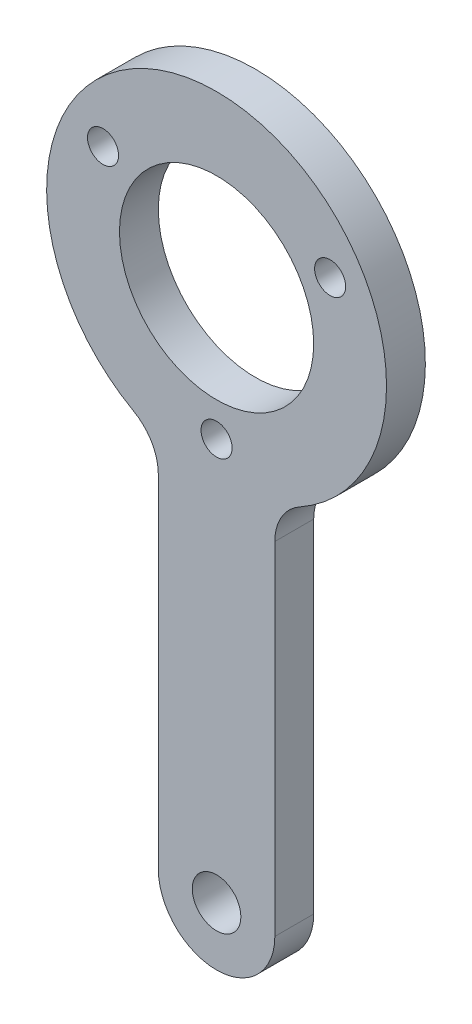
ISO-10303-21;
HEADER;
FILE_DESCRIPTION(('STEP AP214'),'2;1');
FILE_NAME('part.step','',(''),(''),'','','');
FILE_SCHEMA(('AUTOMOTIVE_DESIGN { 1 0 10303 214 1 1 1 1 }'));
ENDSEC;
DATA;
#1=APPLICATION_CONTEXT('core data for automotive mechanical design processes');
#2=APPLICATION_PROTOCOL_DEFINITION('international standard','automotive_design',2000,#1);
#3=PRODUCT_CONTEXT('',#1,'mechanical');
#4=PRODUCT('Part','Part','',(#3));
#5=PRODUCT_RELATED_PRODUCT_CATEGORY('part','',(#4));
#6=PRODUCT_DEFINITION_FORMATION('','',#4);
#7=PRODUCT_DEFINITION_CONTEXT('part definition',#1,'design');
#8=PRODUCT_DEFINITION('design','',#6,#7);
#9=PRODUCT_DEFINITION_SHAPE('','',#8);
#10=(LENGTH_UNIT() NAMED_UNIT(*) SI_UNIT(.MILLI.,.METRE.));
#11=(NAMED_UNIT(*) PLANE_ANGLE_UNIT() SI_UNIT($,.RADIAN.));
#12=(NAMED_UNIT(*) SI_UNIT($,.STERADIAN.) SOLID_ANGLE_UNIT());
#13=UNCERTAINTY_MEASURE_WITH_UNIT(LENGTH_MEASURE(1.E-05),#10,'distance_accuracy_value','');
#14=(GEOMETRIC_REPRESENTATION_CONTEXT(3) GLOBAL_UNCERTAINTY_ASSIGNED_CONTEXT((#13)) GLOBAL_UNIT_ASSIGNED_CONTEXT((#10,
#11,#12)) REPRESENTATION_CONTEXT('',''));
#15=CARTESIAN_POINT('',(0.,0.,0.));
#16=DIRECTION('',(0.,0.,1.));
#17=DIRECTION('',(1.,0.,0.));
#18=AXIS2_PLACEMENT_3D('',#15,#16,#17);
#19=CARTESIAN_POINT('',(6.,-7.36545993132812,4.));
#20=DIRECTION('',(-1.,0.,0.));
#21=DIRECTION('',(0.,-1.,0.));
#22=AXIS2_PLACEMENT_3D('',#19,#20,#21);
#23=PLANE('',#22);
#24=DIRECTION('',(0.,1.,0.));
#25=VECTOR('',#24,1.);
#26=CARTESIAN_POINT('',(6.,-7.36545993132812,0.));
#27=LINE('',#26,#25);
#28=CARTESIAN_POINT('',(6.,-54.8489383568842,0.));
#29=VERTEX_POINT('',#28);
#30=CARTESIAN_POINT('',(6.,-19.6277864263905,0.));
#31=VERTEX_POINT('',#30);
#32=EDGE_CURVE('E65',#29,#31,#27,.T.);
#33=ORIENTED_EDGE('',*,*,#32,.T.);
#34=DIRECTION('',(0.,0.,1.));
#35=VECTOR('',#34,1.);
#36=CARTESIAN_POINT('',(6.,-19.6277864263905,4.));
#37=LINE('',#36,#35);
#38=CARTESIAN_POINT('',(6.,-19.6277864263905,4.));
#39=VERTEX_POINT('',#38);
#40=EDGE_CURVE('E163',#31,#39,#37,.T.);
#41=ORIENTED_EDGE('',*,*,#40,.T.);
#42=DIRECTION('',(0.,1.,0.));
#43=VECTOR('',#42,1.);
#44=CARTESIAN_POINT('',(6.,-7.36545993132812,4.));
#45=LINE('',#44,#43);
#46=CARTESIAN_POINT('',(6.,-54.8489383568842,4.));
#47=VERTEX_POINT('',#46);
#48=EDGE_CURVE('E57',#47,#39,#45,.T.);
#49=ORIENTED_EDGE('',*,*,#48,.F.);
#50=DIRECTION('',(0.,0.,1.));
#51=VECTOR('',#50,1.);
#52=CARTESIAN_POINT('',(6.,-54.8489383568842,0.));
#53=LINE('',#52,#51);
#54=EDGE_CURVE('E113',#29,#47,#53,.T.);
#55=ORIENTED_EDGE('',*,*,#54,.F.);
#56=EDGE_LOOP('',(#33,#41,#49,#55));
#57=FACE_BOUND('',#56,.T.);
#58=ADVANCED_FACE('F41',(#57),#23,.F.);
#59=CARTESIAN_POINT('',(-6.,-7.36545993132812,4.));
#60=DIRECTION('',(1.,0.,0.));
#61=DIRECTION('',(0.,1.,0.));
#62=AXIS2_PLACEMENT_3D('',#59,#60,#61);
#63=PLANE('',#62);
#64=DIRECTION('',(0.,0.,1.));
#65=VECTOR('',#64,1.);
#66=CARTESIAN_POINT('',(-6.,-54.8489383568842,0.));
#67=LINE('',#66,#65);
#68=CARTESIAN_POINT('',(-6.,-54.8489383568842,0.));
#69=VERTEX_POINT('',#68);
#70=CARTESIAN_POINT('',(-6.,-54.8489383568842,4.));
#71=VERTEX_POINT('',#70);
#72=EDGE_CURVE('E100',#69,#71,#67,.T.);
#73=ORIENTED_EDGE('',*,*,#72,.T.);
#74=DIRECTION('',(0.,-1.,0.));
#75=VECTOR('',#74,1.);
#76=CARTESIAN_POINT('',(-6.,-7.36545993132812,4.));
#77=LINE('',#76,#75);
#78=CARTESIAN_POINT('',(-6.,-19.6277864263905,4.));
#79=VERTEX_POINT('',#78);
#80=EDGE_CURVE('E155',#79,#71,#77,.T.);
#81=ORIENTED_EDGE('',*,*,#80,.F.);
#82=DIRECTION('',(0.,0.,1.));
#83=VECTOR('',#82,1.);
#84=CARTESIAN_POINT('',(-6.,-19.6277864263905,4.));
#85=LINE('',#84,#83);
#86=CARTESIAN_POINT('',(-6.,-19.6277864263905,0.));
#87=VERTEX_POINT('',#86);
#88=EDGE_CURVE('E103',#79,#87,#85,.F.);
#89=ORIENTED_EDGE('',*,*,#88,.T.);
#90=DIRECTION('',(0.,-1.,0.));
#91=VECTOR('',#90,1.);
#92=CARTESIAN_POINT('',(-6.,-7.36545993132812,0.));
#93=LINE('',#92,#91);
#94=EDGE_CURVE('E96',#87,#69,#93,.T.);
#95=ORIENTED_EDGE('',*,*,#94,.T.);
#96=EDGE_LOOP('',(#73,#81,#89,#95));
#97=FACE_BOUND('',#96,.T.);
#98=ADVANCED_FACE('F98',(#97),#63,.F.);
#99=CARTESIAN_POINT('',(0.,-45.,4.));
#100=DIRECTION('',(0.,0.,1.));
#101=DIRECTION('',(1.,0.,0.));
#102=AXIS2_PLACEMENT_3D('',#99,#100,#101);
#103=PLANE('',#102);
#104=CARTESIAN_POINT('',(0.,-54.8489383568842,4.));
#105=DIRECTION('',(0.,0.,1.));
#106=DIRECTION('',(1.,0.,0.));
#107=AXIS2_PLACEMENT_3D('',#104,#105,#106);
#108=CIRCLE('',#107,6.);
#109=EDGE_CURVE('E112',#71,#47,#108,.T.);
#110=ORIENTED_EDGE('',*,*,#109,.T.);
#111=ORIENTED_EDGE('',*,*,#48,.T.);
#112=CARTESIAN_POINT('',(11.,-19.6277864263905,4.));
#113=DIRECTION('',(0.,0.,1.));
#114=DIRECTION('',(1.,0.,0.));
#115=AXIS2_PLACEMENT_3D('',#112,#113,#114);
#116=CIRCLE('',#115,5.);
#117=CARTESIAN_POINT('',(8.55555555555556,-15.2660561094149,4.));
#118=VERTEX_POINT('',#117);
#119=EDGE_CURVE('E50',#39,#118,#116,.F.);
#120=ORIENTED_EDGE('',*,*,#119,.T.);
#121=CARTESIAN_POINT('',(0.,0.,4.));
#122=DIRECTION('',(0.,0.,1.));
#123=DIRECTION('',(1.,0.,0.));
#124=AXIS2_PLACEMENT_3D('',#121,#122,#123);
#125=CIRCLE('',#124,17.5);
#126=CARTESIAN_POINT('',(-8.55555555555556,-15.2660561094149,4.));
#127=VERTEX_POINT('',#126);
#128=EDGE_CURVE('E173',#118,#127,#125,.T.);
#129=ORIENTED_EDGE('',*,*,#128,.T.);
#130=CARTESIAN_POINT('',(-11.,-19.6277864263905,4.));
#131=DIRECTION('',(0.,0.,1.));
#132=DIRECTION('',(1.,0.,0.));
#133=AXIS2_PLACEMENT_3D('',#130,#131,#132);
#134=CIRCLE('',#133,5.);
#135=EDGE_CURVE('E169',#127,#79,#134,.F.);
#136=ORIENTED_EDGE('',*,*,#135,.T.);
#137=ORIENTED_EDGE('',*,*,#80,.T.);
#138=EDGE_LOOP('',(#110,#111,#120,#129,#136,#137));
#139=FACE_BOUND('',#138,.T.);
#140=CARTESIAN_POINT('',(-11.6913429510899,6.75,4.));
#141=DIRECTION('',(0.,0.,1.));
#142=DIRECTION('',(1.,0.,0.));
#143=AXIS2_PLACEMENT_3D('',#140,#141,#142);
#144=CIRCLE('',#143,1.6);
#145=CARTESIAN_POINT('',(-10.0913429510899,6.75,4.));
#146=VERTEX_POINT('',#145);
#147=EDGE_CURVE('E194',#146,#146,#144,.T.);
#148=ORIENTED_EDGE('',*,*,#147,.F.);
#149=EDGE_LOOP('',(#148));
#150=FACE_BOUND('',#149,.T.);
#151=CARTESIAN_POINT('',(11.6913429510899,6.75000000000001,4.));
#152=DIRECTION('',(0.,0.,1.));
#153=DIRECTION('',(1.,0.,0.));
#154=AXIS2_PLACEMENT_3D('',#151,#152,#153);
#155=CIRCLE('',#154,1.6);
#156=CARTESIAN_POINT('',(13.2913429510899,6.75000000000001,4.));
#157=VERTEX_POINT('',#156);
#158=EDGE_CURVE('E187',#157,#157,#155,.T.);
#159=ORIENTED_EDGE('',*,*,#158,.F.);
#160=EDGE_LOOP('',(#159));
#161=FACE_BOUND('',#160,.T.);
#162=CARTESIAN_POINT('',(0.,-13.5,4.));
#163=DIRECTION('',(0.,0.,1.));
#164=DIRECTION('',(1.,0.,0.));
#165=AXIS2_PLACEMENT_3D('',#162,#163,#164);
#166=CIRCLE('',#165,1.6);
#167=CARTESIAN_POINT('',(1.6,-13.5,4.));
#168=VERTEX_POINT('',#167);
#169=EDGE_CURVE('E152',#168,#168,#166,.T.);
#170=ORIENTED_EDGE('',*,*,#169,.F.);
#171=EDGE_LOOP('',(#170));
#172=FACE_BOUND('',#171,.T.);
#173=CARTESIAN_POINT('',(0.,0.,4.));
#174=DIRECTION('',(0.,0.,1.));
#175=DIRECTION('',(1.,0.,0.));
#176=AXIS2_PLACEMENT_3D('',#173,#174,#175);
#177=CIRCLE('',#176,10.);
#178=CARTESIAN_POINT('',(10.,0.,4.));
#179=VERTEX_POINT('',#178);
#180=EDGE_CURVE('E153',#179,#179,#177,.T.);
#181=ORIENTED_EDGE('',*,*,#180,.F.);
#182=EDGE_LOOP('',(#181));
#183=FACE_BOUND('',#182,.T.);
#184=CARTESIAN_POINT('',(0.,-54.8489383568842,4.));
#185=DIRECTION('',(0.,0.,1.));
#186=DIRECTION('',(1.,0.,0.));
#187=AXIS2_PLACEMENT_3D('',#184,#185,#186);
#188=CIRCLE('',#187,2.5);
#189=CARTESIAN_POINT('',(2.5,-54.8489383568842,4.));
#190=VERTEX_POINT('',#189);
#191=EDGE_CURVE('E118',#190,#190,#188,.T.);
#192=ORIENTED_EDGE('',*,*,#191,.F.);
#193=EDGE_LOOP('',(#192));
#194=FACE_BOUND('',#193,.T.);
#195=ADVANCED_FACE('F171',(#139,#150,#161,#172,#183,#194),#103,.T.);
#196=CARTESIAN_POINT('',(0.,-45.,0.));
#197=DIRECTION('',(0.,0.,1.));
#198=DIRECTION('',(1.,0.,0.));
#199=AXIS2_PLACEMENT_3D('',#196,#197,#198);
#200=PLANE('',#199);
#201=ORIENTED_EDGE('',*,*,#32,.F.);
#202=CARTESIAN_POINT('',(0.,-54.8489383568842,0.));
#203=DIRECTION('',(0.,0.,1.));
#204=DIRECTION('',(1.,0.,0.));
#205=AXIS2_PLACEMENT_3D('',#202,#203,#204);
#206=CIRCLE('',#205,6.);
#207=EDGE_CURVE('E111',#69,#29,#206,.T.);
#208=ORIENTED_EDGE('',*,*,#207,.F.);
#209=ORIENTED_EDGE('',*,*,#94,.F.);
#210=CARTESIAN_POINT('',(-11.,-19.6277864263905,0.));
#211=DIRECTION('',(0.,0.,1.));
#212=DIRECTION('',(1.,0.,0.));
#213=AXIS2_PLACEMENT_3D('',#210,#211,#212);
#214=CIRCLE('',#213,5.);
#215=CARTESIAN_POINT('',(-8.55555555555556,-15.2660561094149,0.));
#216=VERTEX_POINT('',#215);
#217=EDGE_CURVE('E166',#87,#216,#214,.T.);
#218=ORIENTED_EDGE('',*,*,#217,.T.);
#219=CARTESIAN_POINT('',(0.,0.,0.));
#220=DIRECTION('',(0.,0.,1.));
#221=DIRECTION('',(1.,0.,0.));
#222=AXIS2_PLACEMENT_3D('',#219,#220,#221);
#223=CIRCLE('',#222,17.5);
#224=CARTESIAN_POINT('',(8.55555555555556,-15.2660561094149,0.));
#225=VERTEX_POINT('',#224);
#226=EDGE_CURVE('E179',#225,#216,#223,.T.);
#227=ORIENTED_EDGE('',*,*,#226,.F.);
#228=CARTESIAN_POINT('',(11.,-19.6277864263905,0.));
#229=DIRECTION('',(0.,0.,1.));
#230=DIRECTION('',(1.,0.,0.));
#231=AXIS2_PLACEMENT_3D('',#228,#229,#230);
#232=CIRCLE('',#231,5.);
#233=EDGE_CURVE('E12',#225,#31,#232,.T.);
#234=ORIENTED_EDGE('',*,*,#233,.T.);
#235=EDGE_LOOP('',(#201,#208,#209,#218,#227,#234));
#236=FACE_BOUND('',#235,.T.);
#237=CARTESIAN_POINT('',(-11.6913429510899,6.75,0.));
#238=DIRECTION('',(0.,0.,1.));
#239=DIRECTION('',(1.,0.,0.));
#240=AXIS2_PLACEMENT_3D('',#237,#238,#239);
#241=CIRCLE('',#240,1.6);
#242=CARTESIAN_POINT('',(-10.0913429510899,6.75,0.));
#243=VERTEX_POINT('',#242);
#244=EDGE_CURVE('E190',#243,#243,#241,.T.);
#245=ORIENTED_EDGE('',*,*,#244,.T.);
#246=EDGE_LOOP('',(#245));
#247=FACE_BOUND('',#246,.T.);
#248=CARTESIAN_POINT('',(11.6913429510899,6.75000000000001,0.));
#249=DIRECTION('',(0.,0.,1.));
#250=DIRECTION('',(1.,0.,0.));
#251=AXIS2_PLACEMENT_3D('',#248,#249,#250);
#252=CIRCLE('',#251,1.6);
#253=CARTESIAN_POINT('',(13.2913429510899,6.75000000000001,0.));
#254=VERTEX_POINT('',#253);
#255=EDGE_CURVE('E180',#254,#254,#252,.T.);
#256=ORIENTED_EDGE('',*,*,#255,.T.);
#257=EDGE_LOOP('',(#256));
#258=FACE_BOUND('',#257,.T.);
#259=CARTESIAN_POINT('',(0.,0.,0.));
#260=DIRECTION('',(0.,0.,1.));
#261=DIRECTION('',(1.,0.,0.));
#262=AXIS2_PLACEMENT_3D('',#259,#260,#261);
#263=CIRCLE('',#262,10.);
#264=CARTESIAN_POINT('',(10.,0.,0.));
#265=VERTEX_POINT('',#264);
#266=EDGE_CURVE('E141',#265,#265,#263,.T.);
#267=ORIENTED_EDGE('',*,*,#266,.T.);
#268=EDGE_LOOP('',(#267));
#269=FACE_BOUND('',#268,.T.);
#270=CARTESIAN_POINT('',(0.,-13.5,0.));
#271=DIRECTION('',(0.,0.,1.));
#272=DIRECTION('',(1.,0.,0.));
#273=AXIS2_PLACEMENT_3D('',#270,#271,#272);
#274=CIRCLE('',#273,1.6);
#275=CARTESIAN_POINT('',(1.6,-13.5,0.));
#276=VERTEX_POINT('',#275);
#277=EDGE_CURVE('E137',#276,#276,#274,.T.);
#278=ORIENTED_EDGE('',*,*,#277,.T.);
#279=EDGE_LOOP('',(#278));
#280=FACE_BOUND('',#279,.T.);
#281=CARTESIAN_POINT('',(0.,-54.8489383568842,0.));
#282=DIRECTION('',(0.,0.,1.));
#283=DIRECTION('',(1.,0.,0.));
#284=AXIS2_PLACEMENT_3D('',#281,#282,#283);
#285=CIRCLE('',#284,2.5);
#286=CARTESIAN_POINT('',(2.5,-54.8489383568842,0.));
#287=VERTEX_POINT('',#286);
#288=EDGE_CURVE('E114',#287,#287,#285,.T.);
#289=ORIENTED_EDGE('',*,*,#288,.T.);
#290=EDGE_LOOP('',(#289));
#291=FACE_BOUND('',#290,.T.);
#292=ADVANCED_FACE('F116',(#236,#247,#258,#269,#280,#291),#200,.F.);
#293=CARTESIAN_POINT('',(0.,0.,-6.));
#294=DIRECTION('',(0.,0.,1.));
#295=DIRECTION('',(1.,0.,0.));
#296=AXIS2_PLACEMENT_3D('',#293,#294,#295);
#297=CYLINDRICAL_SURFACE('',#296,10.);
#298=ORIENTED_EDGE('',*,*,#180,.T.);
#299=EDGE_LOOP('',(#298));
#300=FACE_BOUND('',#299,.T.);
#301=ORIENTED_EDGE('',*,*,#266,.F.);
#302=EDGE_LOOP('',(#301));
#303=FACE_BOUND('',#302,.T.);
#304=ADVANCED_FACE('F255',(#300,#303),#297,.F.);
#305=CARTESIAN_POINT('',(0.,-13.5,-6.));
#306=DIRECTION('',(0.,0.,1.));
#307=DIRECTION('',(1.,0.,0.));
#308=AXIS2_PLACEMENT_3D('',#305,#306,#307);
#309=CYLINDRICAL_SURFACE('',#308,1.6);
#310=ORIENTED_EDGE('',*,*,#169,.T.);
#311=EDGE_LOOP('',(#310));
#312=FACE_BOUND('',#311,.T.);
#313=ORIENTED_EDGE('',*,*,#277,.F.);
#314=EDGE_LOOP('',(#313));
#315=FACE_BOUND('',#314,.T.);
#316=ADVANCED_FACE('F252',(#312,#315),#309,.F.);
#317=CARTESIAN_POINT('',(0.,0.,0.));
#318=DIRECTION('',(0.,0.,1.));
#319=DIRECTION('',(1.,0.,0.));
#320=AXIS2_PLACEMENT_3D('',#317,#318,#319);
#321=CYLINDRICAL_SURFACE('',#320,17.5);
#322=ORIENTED_EDGE('',*,*,#226,.T.);
#323=DIRECTION('',(0.,0.,1.));
#324=VECTOR('',#323,1.);
#325=CARTESIAN_POINT('',(-8.55555555555556,-15.2660561094149,0.));
#326=LINE('',#325,#324);
#327=EDGE_CURVE('E157',#216,#127,#326,.T.);
#328=ORIENTED_EDGE('',*,*,#327,.T.);
#329=ORIENTED_EDGE('',*,*,#128,.F.);
#330=DIRECTION('',(0.,0.,1.));
#331=VECTOR('',#330,1.);
#332=CARTESIAN_POINT('',(8.55555555555556,-15.2660561094149,0.));
#333=LINE('',#332,#331);
#334=EDGE_CURVE('E156',#118,#225,#333,.F.);
#335=ORIENTED_EDGE('',*,*,#334,.T.);
#336=EDGE_LOOP('',(#322,#328,#329,#335));
#337=FACE_BOUND('',#336,.T.);
#338=ADVANCED_FACE('F177',(#337),#321,.T.);
#339=CARTESIAN_POINT('',(11.6913429510899,6.75000000000001,0.));
#340=DIRECTION('',(0.,0.,1.));
#341=DIRECTION('',(1.,0.,0.));
#342=AXIS2_PLACEMENT_3D('',#339,#340,#341);
#343=CYLINDRICAL_SURFACE('',#342,1.6);
#344=ORIENTED_EDGE('',*,*,#255,.F.);
#345=EDGE_LOOP('',(#344));
#346=FACE_BOUND('',#345,.T.);
#347=ORIENTED_EDGE('',*,*,#158,.T.);
#348=EDGE_LOOP('',(#347));
#349=FACE_BOUND('',#348,.T.);
#350=ADVANCED_FACE('F204',(#346,#349),#343,.F.);
#351=CARTESIAN_POINT('',(-11.6913429510899,6.75,0.));
#352=DIRECTION('',(0.,0.,1.));
#353=DIRECTION('',(1.,0.,0.));
#354=AXIS2_PLACEMENT_3D('',#351,#352,#353);
#355=CYLINDRICAL_SURFACE('',#354,1.6);
#356=ORIENTED_EDGE('',*,*,#244,.F.);
#357=EDGE_LOOP('',(#356));
#358=FACE_BOUND('',#357,.T.);
#359=ORIENTED_EDGE('',*,*,#147,.T.);
#360=EDGE_LOOP('',(#359));
#361=FACE_BOUND('',#360,.T.);
#362=ADVANCED_FACE('F234',(#358,#361),#355,.F.);
#363=CARTESIAN_POINT('',(-11.,-19.6277864263905,0.));
#364=DIRECTION('',(0.,0.,1.));
#365=DIRECTION('',(1.,0.,0.));
#366=AXIS2_PLACEMENT_3D('',#363,#364,#365);
#367=CYLINDRICAL_SURFACE('',#366,5.);
#368=ORIENTED_EDGE('',*,*,#135,.F.);
#369=ORIENTED_EDGE('',*,*,#327,.F.);
#370=ORIENTED_EDGE('',*,*,#217,.F.);
#371=ORIENTED_EDGE('',*,*,#88,.F.);
#372=EDGE_LOOP('',(#368,#369,#370,#371));
#373=FACE_BOUND('',#372,.T.);
#374=ADVANCED_FACE('F232',(#373),#367,.F.);
#375=CARTESIAN_POINT('',(11.,-19.6277864263905,0.));
#376=DIRECTION('',(0.,0.,1.));
#377=DIRECTION('',(1.,0.,0.));
#378=AXIS2_PLACEMENT_3D('',#375,#376,#377);
#379=CYLINDRICAL_SURFACE('',#378,5.);
#380=ORIENTED_EDGE('',*,*,#233,.F.);
#381=ORIENTED_EDGE('',*,*,#334,.F.);
#382=ORIENTED_EDGE('',*,*,#119,.F.);
#383=ORIENTED_EDGE('',*,*,#40,.F.);
#384=EDGE_LOOP('',(#380,#381,#382,#383));
#385=FACE_BOUND('',#384,.T.);
#386=ADVANCED_FACE('F43',(#385),#379,.F.);
#387=CARTESIAN_POINT('',(0.,-54.8489383568842,0.));
#388=DIRECTION('',(0.,0.,1.));
#389=DIRECTION('',(1.,0.,0.));
#390=AXIS2_PLACEMENT_3D('',#387,#388,#389);
#391=CYLINDRICAL_SURFACE('',#390,6.);
#392=ORIENTED_EDGE('',*,*,#109,.F.);
#393=ORIENTED_EDGE('',*,*,#72,.F.);
#394=ORIENTED_EDGE('',*,*,#207,.T.);
#395=ORIENTED_EDGE('',*,*,#54,.T.);
#396=EDGE_LOOP('',(#392,#393,#394,#395));
#397=FACE_BOUND('',#396,.T.);
#398=ADVANCED_FACE('F109',(#397),#391,.T.);
#399=CARTESIAN_POINT('',(0.,-54.8489383568842,0.));
#400=DIRECTION('',(0.,0.,1.));
#401=DIRECTION('',(1.,0.,0.));
#402=AXIS2_PLACEMENT_3D('',#399,#400,#401);
#403=CYLINDRICAL_SURFACE('',#402,2.5);
#404=ORIENTED_EDGE('',*,*,#288,.F.);
#405=EDGE_LOOP('',(#404));
#406=FACE_BOUND('',#405,.T.);
#407=ORIENTED_EDGE('',*,*,#191,.T.);
#408=EDGE_LOOP('',(#407));
#409=FACE_BOUND('',#408,.T.);
#410=ADVANCED_FACE('F216',(#406,#409),#403,.F.);
#411=CLOSED_SHELL('',(#58,#98,#195,#292,#304,#316,#338,#350,#362,#374,#386,#398,#410));
#412=MANIFOLD_SOLID_BREP('B2',#411);
#413=ADVANCED_BREP_SHAPE_REPRESENTATION('',(#18,#412),#14);
#414=SHAPE_DEFINITION_REPRESENTATION(#9,#413);
ENDSEC;
END-ISO-10303-21;
